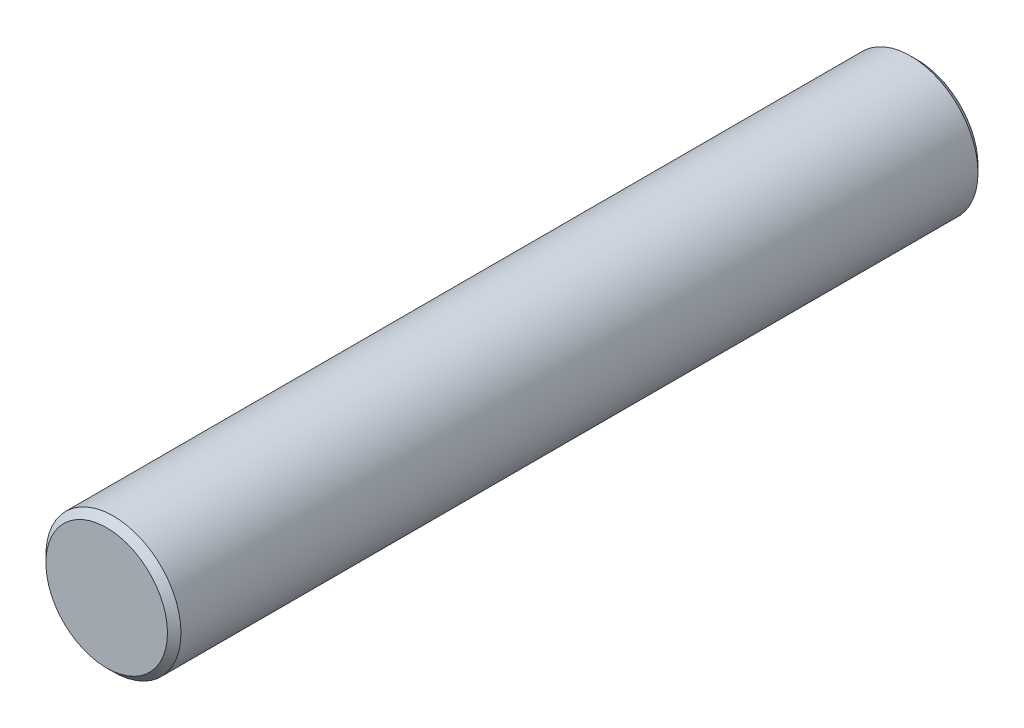
ISO-10303-21;
HEADER;
FILE_DESCRIPTION(('STEP AP214'),'2;1');
FILE_NAME('part.step','',(''),(''),'','','');
FILE_SCHEMA(('AUTOMOTIVE_DESIGN { 1 0 10303 214 1 1 1 1 }'));
ENDSEC;
DATA;
#1=APPLICATION_CONTEXT('core data for automotive mechanical design processes');
#2=APPLICATION_PROTOCOL_DEFINITION('international standard','automotive_design',2000,#1);
#3=PRODUCT_CONTEXT('',#1,'mechanical');
#4=PRODUCT('Part','Part','',(#3));
#5=PRODUCT_RELATED_PRODUCT_CATEGORY('part','',(#4));
#6=PRODUCT_DEFINITION_FORMATION('','',#4);
#7=PRODUCT_DEFINITION_CONTEXT('part definition',#1,'design');
#8=PRODUCT_DEFINITION('design','',#6,#7);
#9=PRODUCT_DEFINITION_SHAPE('','',#8);
#10=(LENGTH_UNIT() NAMED_UNIT(*) SI_UNIT(.MILLI.,.METRE.));
#11=(NAMED_UNIT(*) PLANE_ANGLE_UNIT() SI_UNIT($,.RADIAN.));
#12=(NAMED_UNIT(*) SI_UNIT($,.STERADIAN.) SOLID_ANGLE_UNIT());
#13=UNCERTAINTY_MEASURE_WITH_UNIT(LENGTH_MEASURE(1.E-05),#10,'distance_accuracy_value','');
#14=(GEOMETRIC_REPRESENTATION_CONTEXT(3) GLOBAL_UNCERTAINTY_ASSIGNED_CONTEXT((#13)) GLOBAL_UNIT_ASSIGNED_CONTEXT((#10,
#11,#12)) REPRESENTATION_CONTEXT('',''));
#15=CARTESIAN_POINT('',(0.,0.,0.));
#16=DIRECTION('',(0.,0.,1.));
#17=DIRECTION('',(1.,0.,0.));
#18=AXIS2_PLACEMENT_3D('',#15,#16,#17);
#19=CARTESIAN_POINT('',(0.,0.,15.));
#20=DIRECTION('',(0.,0.,-1.));
#21=DIRECTION('',(-1.,0.,0.));
#22=AXIS2_PLACEMENT_3D('',#19,#20,#21);
#23=CYLINDRICAL_SURFACE('',#22,2.5);
#24=CARTESIAN_POINT('',(0.,0.,-14.75));
#25=DIRECTION('',(0.,0.,1.));
#26=DIRECTION('',(1.,0.,0.));
#27=AXIS2_PLACEMENT_3D('',#24,#25,#26);
#28=CIRCLE('',#27,2.5);
#29=CARTESIAN_POINT('',(2.5,0.,-14.75));
#30=VERTEX_POINT('',#29);
#31=EDGE_CURVE('E47',#30,#30,#28,.T.);
#32=ORIENTED_EDGE('',*,*,#31,.T.);
#33=EDGE_LOOP('',(#32));
#34=FACE_BOUND('',#33,.T.);
#35=CARTESIAN_POINT('',(0.,0.,14.75));
#36=DIRECTION('',(0.,0.,1.));
#37=DIRECTION('',(1.,0.,0.));
#38=AXIS2_PLACEMENT_3D('',#35,#36,#37);
#39=CIRCLE('',#38,2.5);
#40=CARTESIAN_POINT('',(2.5,0.,14.75));
#41=VERTEX_POINT('',#40);
#42=EDGE_CURVE('E51',#41,#41,#39,.F.);
#43=ORIENTED_EDGE('',*,*,#42,.T.);
#44=EDGE_LOOP('',(#43));
#45=FACE_BOUND('',#44,.T.);
#46=ADVANCED_FACE('F35',(#34,#45),#23,.T.);
#47=CARTESIAN_POINT('',(0.,0.,15.));
#48=DIRECTION('',(0.,0.,1.));
#49=DIRECTION('',(1.,0.,0.));
#50=AXIS2_PLACEMENT_3D('',#47,#48,#49);
#51=PLANE('',#50);
#52=CARTESIAN_POINT('',(0.,0.,15.));
#53=DIRECTION('',(0.,0.,1.));
#54=DIRECTION('',(1.,0.,0.));
#55=AXIS2_PLACEMENT_3D('',#52,#53,#54);
#56=CIRCLE('',#55,2.25);
#57=CARTESIAN_POINT('',(2.25,0.,15.));
#58=VERTEX_POINT('',#57);
#59=EDGE_CURVE('E10',#58,#58,#56,.T.);
#60=ORIENTED_EDGE('',*,*,#59,.T.);
#61=EDGE_LOOP('',(#60));
#62=FACE_BOUND('',#61,.T.);
#63=ADVANCED_FACE('F67',(#62),#51,.T.);
#64=CARTESIAN_POINT('',(0.,0.,-15.));
#65=DIRECTION('',(0.,0.,1.));
#66=DIRECTION('',(1.,0.,0.));
#67=AXIS2_PLACEMENT_3D('',#64,#65,#66);
#68=PLANE('',#67);
#69=CARTESIAN_POINT('',(0.,0.,-15.));
#70=DIRECTION('',(0.,0.,1.));
#71=DIRECTION('',(1.,0.,0.));
#72=AXIS2_PLACEMENT_3D('',#69,#70,#71);
#73=CIRCLE('',#72,2.25);
#74=CARTESIAN_POINT('',(2.25,0.,-15.));
#75=VERTEX_POINT('',#74);
#76=EDGE_CURVE('E43',#75,#75,#73,.F.);
#77=ORIENTED_EDGE('',*,*,#76,.T.);
#78=EDGE_LOOP('',(#77));
#79=FACE_BOUND('',#78,.T.);
#80=ADVANCED_FACE('F64',(#79),#68,.F.);
#81=CARTESIAN_POINT('',(0.,0.,-14.75));
#82=DIRECTION('',(0.,0.,1.));
#83=DIRECTION('',(1.,0.,0.));
#84=AXIS2_PLACEMENT_3D('',#81,#82,#83);
#85=CONICAL_SURFACE('',#84,2.5,0.785398163397458);
#86=ORIENTED_EDGE('',*,*,#76,.F.);
#87=EDGE_LOOP('',(#86));
#88=FACE_BOUND('',#87,.T.);
#89=ORIENTED_EDGE('',*,*,#31,.F.);
#90=EDGE_LOOP('',(#89));
#91=FACE_BOUND('',#90,.T.);
#92=ADVANCED_FACE('F60',(#88,#91),#85,.T.);
#93=CARTESIAN_POINT('',(0.,0.,15.));
#94=DIRECTION('',(0.,0.,-1.));
#95=DIRECTION('',(-1.,0.,0.));
#96=AXIS2_PLACEMENT_3D('',#93,#94,#95);
#97=CONICAL_SURFACE('',#96,2.25,0.785398163397451);
#98=ORIENTED_EDGE('',*,*,#42,.F.);
#99=EDGE_LOOP('',(#98));
#100=FACE_BOUND('',#99,.T.);
#101=ORIENTED_EDGE('',*,*,#59,.F.);
#102=EDGE_LOOP('',(#101));
#103=FACE_BOUND('',#102,.T.);
#104=ADVANCED_FACE('F38',(#100,#103),#97,.T.);
#105=CLOSED_SHELL('',(#46,#63,#80,#92,#104));
#106=MANIFOLD_SOLID_BREP('B2',#105);
#107=ADVANCED_BREP_SHAPE_REPRESENTATION('',(#18,#106),#14);
#108=SHAPE_DEFINITION_REPRESENTATION(#9,#107);
ENDSEC;
END-ISO-10303-21;
